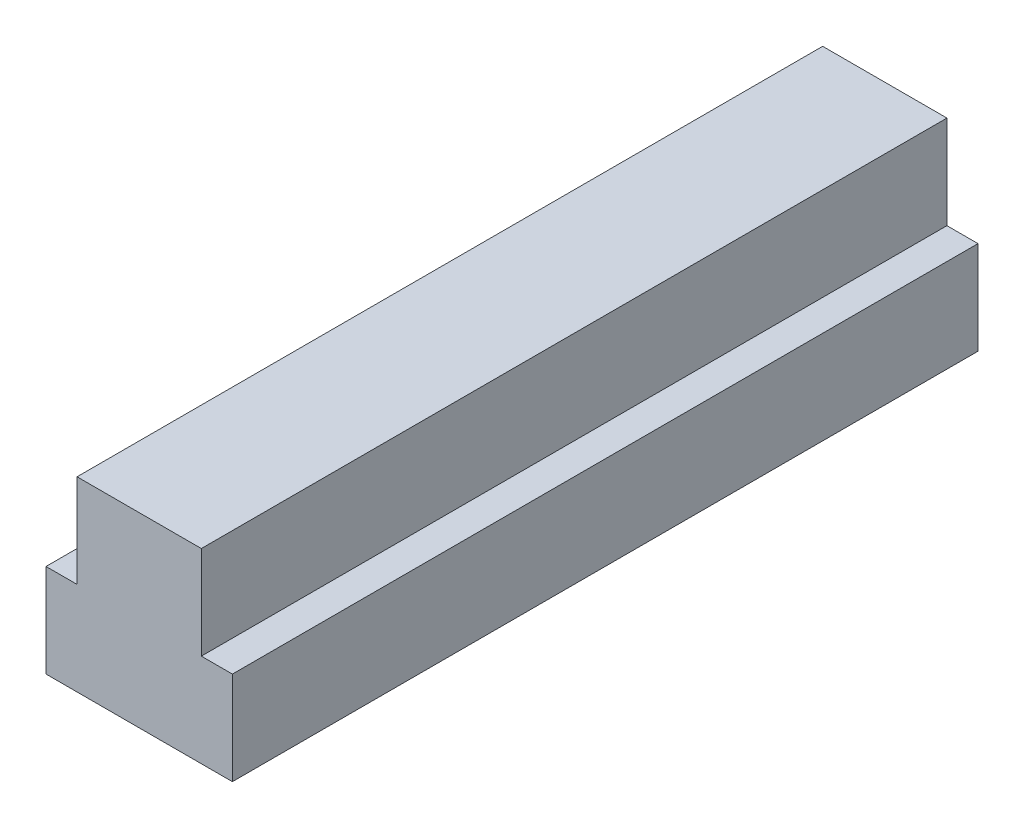
ISO-10303-21;
HEADER;
FILE_DESCRIPTION(('STEP AP214'),'2;1');
FILE_NAME('part.step','',(''),(''),'','','');
FILE_SCHEMA(('AUTOMOTIVE_DESIGN { 1 0 10303 214 1 1 1 1 }'));
ENDSEC;
DATA;
#1=APPLICATION_CONTEXT('core data for automotive mechanical design processes');
#2=APPLICATION_PROTOCOL_DEFINITION('international standard','automotive_design',2000,#1);
#3=PRODUCT_CONTEXT('',#1,'mechanical');
#4=PRODUCT('Part','Part','',(#3));
#5=PRODUCT_RELATED_PRODUCT_CATEGORY('part','',(#4));
#6=PRODUCT_DEFINITION_FORMATION('','',#4);
#7=PRODUCT_DEFINITION_CONTEXT('part definition',#1,'design');
#8=PRODUCT_DEFINITION('design','',#6,#7);
#9=PRODUCT_DEFINITION_SHAPE('','',#8);
#10=(LENGTH_UNIT() NAMED_UNIT(*) SI_UNIT(.MILLI.,.METRE.));
#11=(NAMED_UNIT(*) PLANE_ANGLE_UNIT() SI_UNIT($,.RADIAN.));
#12=(NAMED_UNIT(*) SI_UNIT($,.STERADIAN.) SOLID_ANGLE_UNIT());
#13=UNCERTAINTY_MEASURE_WITH_UNIT(LENGTH_MEASURE(1.E-05),#10,'distance_accuracy_value','');
#14=(GEOMETRIC_REPRESENTATION_CONTEXT(3) GLOBAL_UNCERTAINTY_ASSIGNED_CONTEXT((#13)) GLOBAL_UNIT_ASSIGNED_CONTEXT((#10,
#11,#12)) REPRESENTATION_CONTEXT('',''));
#15=CARTESIAN_POINT('',(0.,0.,0.));
#16=DIRECTION('',(0.,0.,1.));
#17=DIRECTION('',(1.,0.,0.));
#18=AXIS2_PLACEMENT_3D('',#15,#16,#17);
#19=CARTESIAN_POINT('',(0.,1.190625,19.05));
#20=DIRECTION('',(0.,-1.,0.));
#21=DIRECTION('',(1.,0.,0.));
#22=AXIS2_PLACEMENT_3D('',#19,#20,#21);
#23=PLANE('',#22);
#24=DIRECTION('',(-1.,0.,0.));
#25=VECTOR('',#24,1.);
#26=CARTESIAN_POINT('',(0.,1.190625,0.));
#27=LINE('',#26,#25);
#28=CARTESIAN_POINT('',(2.38125,1.190625,0.));
#29=VERTEX_POINT('',#28);
#30=CARTESIAN_POINT('',(1.5875,1.190625,0.));
#31=VERTEX_POINT('',#30);
#32=EDGE_CURVE('E132',#29,#31,#27,.T.);
#33=ORIENTED_EDGE('',*,*,#32,.T.);
#34=DIRECTION('',(0.,0.,-1.));
#35=VECTOR('',#34,1.);
#36=CARTESIAN_POINT('',(1.5875,1.190625,19.05));
#37=LINE('',#36,#35);
#38=CARTESIAN_POINT('',(1.5875,1.190625,19.05));
#39=VERTEX_POINT('',#38);
#40=EDGE_CURVE('E11',#39,#31,#37,.T.);
#41=ORIENTED_EDGE('',*,*,#40,.F.);
#42=DIRECTION('',(-1.,0.,0.));
#43=VECTOR('',#42,1.);
#44=CARTESIAN_POINT('',(0.,1.190625,19.05));
#45=LINE('',#44,#43);
#46=CARTESIAN_POINT('',(2.38125,1.190625,19.05));
#47=VERTEX_POINT('',#46);
#48=EDGE_CURVE('E150',#47,#39,#45,.T.);
#49=ORIENTED_EDGE('',*,*,#48,.F.);
#50=DIRECTION('',(0.,0.,-1.));
#51=VECTOR('',#50,1.);
#52=CARTESIAN_POINT('',(2.38125,1.190625,19.05));
#53=LINE('',#52,#51);
#54=EDGE_CURVE('E50',#47,#29,#53,.T.);
#55=ORIENTED_EDGE('',*,*,#54,.T.);
#56=EDGE_LOOP('',(#33,#41,#49,#55));
#57=FACE_BOUND('',#56,.T.);
#58=ADVANCED_FACE('F33',(#57),#23,.F.);
#59=CARTESIAN_POINT('',(1.5875,0.,19.05));
#60=DIRECTION('',(-1.,0.,0.));
#61=DIRECTION('',(0.,-1.,0.));
#62=AXIS2_PLACEMENT_3D('',#59,#60,#61);
#63=PLANE('',#62);
#64=DIRECTION('',(0.,1.,0.));
#65=VECTOR('',#64,1.);
#66=CARTESIAN_POINT('',(1.5875,0.,0.));
#67=LINE('',#66,#65);
#68=CARTESIAN_POINT('',(1.5875,3.571875,0.));
#69=VERTEX_POINT('',#68);
#70=EDGE_CURVE('E134',#31,#69,#67,.T.);
#71=ORIENTED_EDGE('',*,*,#70,.T.);
#72=DIRECTION('',(0.,0.,-1.));
#73=VECTOR('',#72,1.);
#74=CARTESIAN_POINT('',(1.5875,3.571875,19.05));
#75=LINE('',#74,#73);
#76=CARTESIAN_POINT('',(1.5875,3.571875,19.05));
#77=VERTEX_POINT('',#76);
#78=EDGE_CURVE('E42',#77,#69,#75,.T.);
#79=ORIENTED_EDGE('',*,*,#78,.F.);
#80=DIRECTION('',(0.,1.,0.));
#81=VECTOR('',#80,1.);
#82=CARTESIAN_POINT('',(1.5875,0.,19.05));
#83=LINE('',#82,#81);
#84=EDGE_CURVE('E88',#39,#77,#83,.T.);
#85=ORIENTED_EDGE('',*,*,#84,.F.);
#86=ORIENTED_EDGE('',*,*,#40,.T.);
#87=EDGE_LOOP('',(#71,#79,#85,#86));
#88=FACE_BOUND('',#87,.T.);
#89=ADVANCED_FACE('F35',(#88),#63,.F.);
#90=CARTESIAN_POINT('',(0.,3.571875,19.05));
#91=DIRECTION('',(0.,1.,0.));
#92=DIRECTION('',(0.,0.,1.));
#93=AXIS2_PLACEMENT_3D('',#90,#91,#92);
#94=PLANE('',#93);
#95=DIRECTION('',(1.,0.,0.));
#96=VECTOR('',#95,1.);
#97=CARTESIAN_POINT('',(0.,3.571875,0.));
#98=LINE('',#97,#96);
#99=CARTESIAN_POINT('',(-1.5875,3.571875,0.));
#100=VERTEX_POINT('',#99);
#101=EDGE_CURVE('E138',#100,#69,#98,.T.);
#102=ORIENTED_EDGE('',*,*,#101,.F.);
#103=DIRECTION('',(0.,0.,-1.));
#104=VECTOR('',#103,1.);
#105=CARTESIAN_POINT('',(-1.5875,3.571875,19.05));
#106=LINE('',#105,#104);
#107=CARTESIAN_POINT('',(-1.5875,3.571875,19.05));
#108=VERTEX_POINT('',#107);
#109=EDGE_CURVE('E156',#108,#100,#106,.T.);
#110=ORIENTED_EDGE('',*,*,#109,.F.);
#111=DIRECTION('',(1.,0.,0.));
#112=VECTOR('',#111,1.);
#113=CARTESIAN_POINT('',(0.,3.571875,19.05));
#114=LINE('',#113,#112);
#115=EDGE_CURVE('E162',#108,#77,#114,.T.);
#116=ORIENTED_EDGE('',*,*,#115,.T.);
#117=ORIENTED_EDGE('',*,*,#78,.T.);
#118=EDGE_LOOP('',(#102,#110,#116,#117));
#119=FACE_BOUND('',#118,.T.);
#120=ADVANCED_FACE('F160',(#119),#94,.T.);
#121=CARTESIAN_POINT('',(-1.5875,0.,19.05));
#122=DIRECTION('',(-1.,0.,0.));
#123=DIRECTION('',(0.,0.,1.));
#124=AXIS2_PLACEMENT_3D('',#121,#122,#123);
#125=PLANE('',#124);
#126=DIRECTION('',(0.,1.,0.));
#127=VECTOR('',#126,1.);
#128=CARTESIAN_POINT('',(-1.5875,0.,0.));
#129=LINE('',#128,#127);
#130=CARTESIAN_POINT('',(-1.5875,1.190625,0.));
#131=VERTEX_POINT('',#130);
#132=EDGE_CURVE('E141',#131,#100,#129,.T.);
#133=ORIENTED_EDGE('',*,*,#132,.F.);
#134=DIRECTION('',(0.,0.,-1.));
#135=VECTOR('',#134,1.);
#136=CARTESIAN_POINT('',(-1.5875,1.190625,19.05));
#137=LINE('',#136,#135);
#138=CARTESIAN_POINT('',(-1.5875,1.190625,19.05));
#139=VERTEX_POINT('',#138);
#140=EDGE_CURVE('E154',#139,#131,#137,.T.);
#141=ORIENTED_EDGE('',*,*,#140,.F.);
#142=DIRECTION('',(0.,1.,0.));
#143=VECTOR('',#142,1.);
#144=CARTESIAN_POINT('',(-1.5875,0.,19.05));
#145=LINE('',#144,#143);
#146=EDGE_CURVE('E171',#139,#108,#145,.T.);
#147=ORIENTED_EDGE('',*,*,#146,.T.);
#148=ORIENTED_EDGE('',*,*,#109,.T.);
#149=EDGE_LOOP('',(#133,#141,#147,#148));
#150=FACE_BOUND('',#149,.T.);
#151=ADVANCED_FACE('F169',(#150),#125,.T.);
#152=CARTESIAN_POINT('',(-2.38125,1.190625,0.));
#153=VERTEX_POINT('',#152);
#154=EDGE_CURVE('E135',#131,#153,#27,.T.);
#155=ORIENTED_EDGE('',*,*,#154,.T.);
#156=DIRECTION('',(0.,0.,-1.));
#157=VECTOR('',#156,1.);
#158=CARTESIAN_POINT('',(-2.38125,1.190625,19.05));
#159=LINE('',#158,#157);
#160=CARTESIAN_POINT('',(-2.38125,1.190625,19.05));
#161=VERTEX_POINT('',#160);
#162=EDGE_CURVE('E124',#161,#153,#159,.T.);
#163=ORIENTED_EDGE('',*,*,#162,.F.);
#164=EDGE_CURVE('E112',#139,#161,#45,.T.);
#165=ORIENTED_EDGE('',*,*,#164,.F.);
#166=ORIENTED_EDGE('',*,*,#140,.T.);
#167=EDGE_LOOP('',(#155,#163,#165,#166));
#168=FACE_BOUND('',#167,.T.);
#169=ADVANCED_FACE('F187',(#168),#23,.F.);
#170=CARTESIAN_POINT('',(-2.38125,0.,19.05));
#171=DIRECTION('',(1.,0.,0.));
#172=DIRECTION('',(0.,0.,-1.));
#173=AXIS2_PLACEMENT_3D('',#170,#171,#172);
#174=PLANE('',#173);
#175=DIRECTION('',(0.,-1.,0.));
#176=VECTOR('',#175,1.);
#177=CARTESIAN_POINT('',(-2.38125,0.,0.));
#178=LINE('',#177,#176);
#179=CARTESIAN_POINT('',(-2.38125,-1.190625,0.));
#180=VERTEX_POINT('',#179);
#181=EDGE_CURVE('E121',#153,#180,#178,.T.);
#182=ORIENTED_EDGE('',*,*,#181,.T.);
#183=DIRECTION('',(0.,0.,-1.));
#184=VECTOR('',#183,1.);
#185=CARTESIAN_POINT('',(-2.38125,-1.190625,19.05));
#186=LINE('',#185,#184);
#187=CARTESIAN_POINT('',(-2.38125,-1.190625,19.05));
#188=VERTEX_POINT('',#187);
#189=EDGE_CURVE('E118',#188,#180,#186,.T.);
#190=ORIENTED_EDGE('',*,*,#189,.F.);
#191=DIRECTION('',(0.,-1.,0.));
#192=VECTOR('',#191,1.);
#193=CARTESIAN_POINT('',(-2.38125,0.,19.05));
#194=LINE('',#193,#192);
#195=EDGE_CURVE('E104',#161,#188,#194,.T.);
#196=ORIENTED_EDGE('',*,*,#195,.F.);
#197=ORIENTED_EDGE('',*,*,#162,.T.);
#198=EDGE_LOOP('',(#182,#190,#196,#197));
#199=FACE_BOUND('',#198,.T.);
#200=ADVANCED_FACE('F119',(#199),#174,.F.);
#201=CARTESIAN_POINT('',(0.,-1.190625,19.05));
#202=DIRECTION('',(0.,-1.,0.));
#203=DIRECTION('',(1.,0.,0.));
#204=AXIS2_PLACEMENT_3D('',#201,#202,#203);
#205=PLANE('',#204);
#206=DIRECTION('',(-1.,0.,0.));
#207=VECTOR('',#206,1.);
#208=CARTESIAN_POINT('',(0.,-1.190625,0.));
#209=LINE('',#208,#207);
#210=CARTESIAN_POINT('',(2.38125,-1.190625,0.));
#211=VERTEX_POINT('',#210);
#212=EDGE_CURVE('E145',#211,#180,#209,.T.);
#213=ORIENTED_EDGE('',*,*,#212,.F.);
#214=DIRECTION('',(0.,0.,-1.));
#215=VECTOR('',#214,1.);
#216=CARTESIAN_POINT('',(2.38125,-1.190625,19.05));
#217=LINE('',#216,#215);
#218=CARTESIAN_POINT('',(2.38125,-1.190625,19.05));
#219=VERTEX_POINT('',#218);
#220=EDGE_CURVE('E76',#219,#211,#217,.T.);
#221=ORIENTED_EDGE('',*,*,#220,.F.);
#222=DIRECTION('',(-1.,0.,0.));
#223=VECTOR('',#222,1.);
#224=CARTESIAN_POINT('',(0.,-1.190625,19.05));
#225=LINE('',#224,#223);
#226=EDGE_CURVE('E109',#219,#188,#225,.T.);
#227=ORIENTED_EDGE('',*,*,#226,.T.);
#228=ORIENTED_EDGE('',*,*,#189,.T.);
#229=EDGE_LOOP('',(#213,#221,#227,#228));
#230=FACE_BOUND('',#229,.T.);
#231=ADVANCED_FACE('F126',(#230),#205,.T.);
#232=CARTESIAN_POINT('',(2.38125,0.,19.05));
#233=DIRECTION('',(1.,0.,0.));
#234=DIRECTION('',(0.,0.,-1.));
#235=AXIS2_PLACEMENT_3D('',#232,#233,#234);
#236=PLANE('',#235);
#237=DIRECTION('',(0.,-1.,0.));
#238=VECTOR('',#237,1.);
#239=CARTESIAN_POINT('',(2.38125,0.,0.));
#240=LINE('',#239,#238);
#241=EDGE_CURVE('E147',#29,#211,#240,.T.);
#242=ORIENTED_EDGE('',*,*,#241,.F.);
#243=ORIENTED_EDGE('',*,*,#54,.F.);
#244=DIRECTION('',(0.,-1.,0.));
#245=VECTOR('',#244,1.);
#246=CARTESIAN_POINT('',(2.38125,0.,19.05));
#247=LINE('',#246,#245);
#248=EDGE_CURVE('E127',#47,#219,#247,.T.);
#249=ORIENTED_EDGE('',*,*,#248,.T.);
#250=ORIENTED_EDGE('',*,*,#220,.T.);
#251=EDGE_LOOP('',(#242,#243,#249,#250));
#252=FACE_BOUND('',#251,.T.);
#253=ADVANCED_FACE('F175',(#252),#236,.T.);
#254=CARTESIAN_POINT('',(0.,0.,19.05));
#255=DIRECTION('',(0.,0.,1.));
#256=DIRECTION('',(1.,0.,0.));
#257=AXIS2_PLACEMENT_3D('',#254,#255,#256);
#258=PLANE('',#257);
#259=ORIENTED_EDGE('',*,*,#48,.T.);
#260=ORIENTED_EDGE('',*,*,#84,.T.);
#261=ORIENTED_EDGE('',*,*,#115,.F.);
#262=ORIENTED_EDGE('',*,*,#146,.F.);
#263=ORIENTED_EDGE('',*,*,#164,.T.);
#264=ORIENTED_EDGE('',*,*,#195,.T.);
#265=ORIENTED_EDGE('',*,*,#226,.F.);
#266=ORIENTED_EDGE('',*,*,#248,.F.);
#267=EDGE_LOOP('',(#259,#260,#261,#262,#263,#264,#265,#266));
#268=FACE_BOUND('',#267,.T.);
#269=ADVANCED_FACE('F106',(#268),#258,.T.);
#270=CARTESIAN_POINT('',(0.,0.,0.));
#271=DIRECTION('',(0.,0.,1.));
#272=DIRECTION('',(1.,0.,0.));
#273=AXIS2_PLACEMENT_3D('',#270,#271,#272);
#274=PLANE('',#273);
#275=ORIENTED_EDGE('',*,*,#32,.F.);
#276=ORIENTED_EDGE('',*,*,#241,.T.);
#277=ORIENTED_EDGE('',*,*,#212,.T.);
#278=ORIENTED_EDGE('',*,*,#181,.F.);
#279=ORIENTED_EDGE('',*,*,#154,.F.);
#280=ORIENTED_EDGE('',*,*,#132,.T.);
#281=ORIENTED_EDGE('',*,*,#101,.T.);
#282=ORIENTED_EDGE('',*,*,#70,.F.);
#283=EDGE_LOOP('',(#275,#276,#277,#278,#279,#280,#281,#282));
#284=FACE_BOUND('',#283,.T.);
#285=ADVANCED_FACE('F165',(#284),#274,.F.);
#286=CLOSED_SHELL('',(#58,#89,#120,#151,#169,#200,#231,#253,#269,#285));
#287=MANIFOLD_SOLID_BREP('B2',#286);
#288=ADVANCED_BREP_SHAPE_REPRESENTATION('',(#18,#287),#14);
#289=SHAPE_DEFINITION_REPRESENTATION(#9,#288);
ENDSEC;
END-ISO-10303-21;
